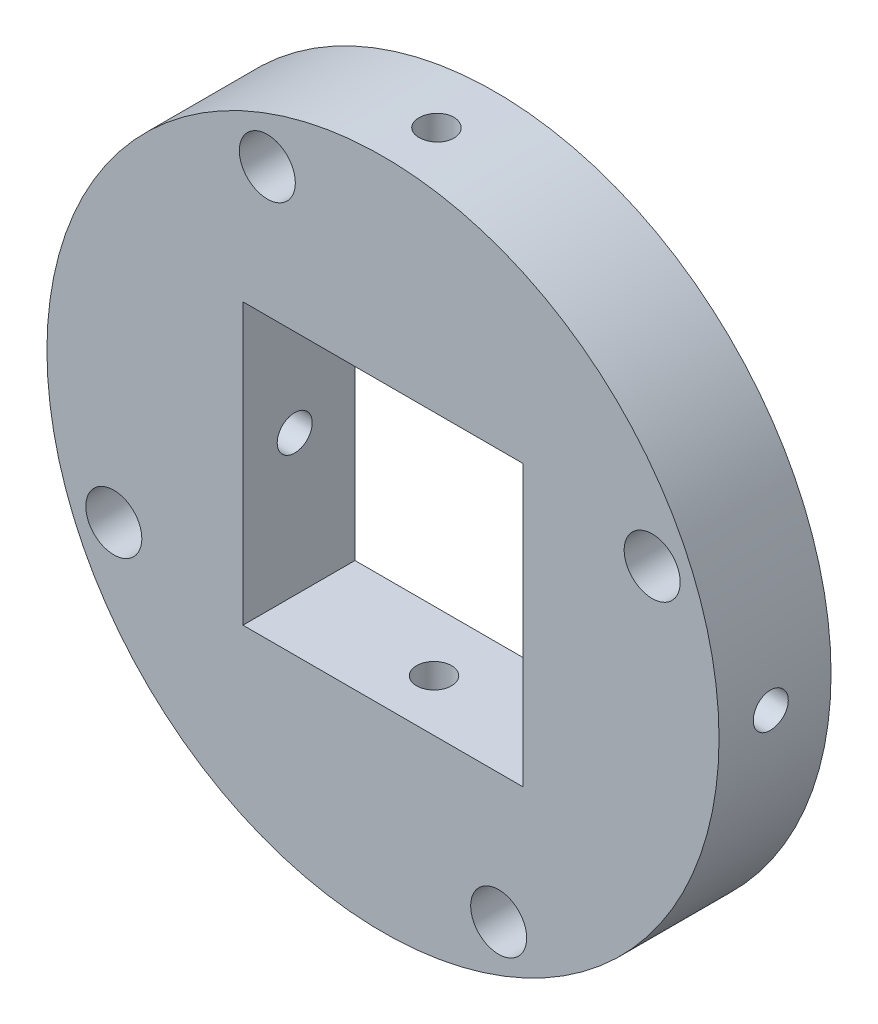
ISO-10303-21;
HEADER;
FILE_DESCRIPTION(('STEP AP214'),'2;1');
FILE_NAME('part.step','',(''),(''),'','','');
FILE_SCHEMA(('AUTOMOTIVE_DESIGN { 1 0 10303 214 1 1 1 1 }'));
ENDSEC;
DATA;
#1=APPLICATION_CONTEXT('core data for automotive mechanical design processes');
#2=APPLICATION_PROTOCOL_DEFINITION('international standard','automotive_design',2000,#1);
#3=PRODUCT_CONTEXT('',#1,'mechanical');
#4=PRODUCT('Part','Part','',(#3));
#5=PRODUCT_RELATED_PRODUCT_CATEGORY('part','',(#4));
#6=PRODUCT_DEFINITION_FORMATION('','',#4);
#7=PRODUCT_DEFINITION_CONTEXT('part definition',#1,'design');
#8=PRODUCT_DEFINITION('design','',#6,#7);
#9=PRODUCT_DEFINITION_SHAPE('','',#8);
#10=(LENGTH_UNIT() NAMED_UNIT(*) SI_UNIT(.MILLI.,.METRE.));
#11=(NAMED_UNIT(*) PLANE_ANGLE_UNIT() SI_UNIT($,.RADIAN.));
#12=(NAMED_UNIT(*) SI_UNIT($,.STERADIAN.) SOLID_ANGLE_UNIT());
#13=UNCERTAINTY_MEASURE_WITH_UNIT(LENGTH_MEASURE(1.E-05),#10,'distance_accuracy_value','');
#14=(GEOMETRIC_REPRESENTATION_CONTEXT(3) GLOBAL_UNCERTAINTY_ASSIGNED_CONTEXT((#13)) GLOBAL_UNIT_ASSIGNED_CONTEXT((#10,
#11,#12)) REPRESENTATION_CONTEXT('',''));
#15=CARTESIAN_POINT('',(0.,0.,0.));
#16=DIRECTION('',(0.,0.,1.));
#17=DIRECTION('',(1.,0.,0.));
#18=AXIS2_PLACEMENT_3D('',#15,#16,#17);
#19=CARTESIAN_POINT('',(0.,0.,2.54));
#20=DIRECTION('',(0.,0.,-1.));
#21=DIRECTION('',(-1.,0.,0.));
#22=AXIS2_PLACEMENT_3D('',#19,#20,#21);
#23=CYLINDRICAL_SURFACE('',#22,7.62);
#24=CARTESIAN_POINT('',(7.61157528645411,0.358220125957554,1.36675570991861));
#25=CARTESIAN_POINT('',(7.61157542030616,0.358219142552369,1.34447929381104));
#26=CARTESIAN_POINT('',(7.61166459620555,0.356337800310015,1.32218711008212));
#27=CARTESIAN_POINT('',(7.61201093684286,0.348859525222098,1.27821779440879));
#28=CARTESIAN_POINT('',(7.61226829914491,0.343258222511361,1.25654141712227));
#29=CARTESIAN_POINT('',(7.61291936793678,0.32850103678676,1.21444701123592));
#30=CARTESIAN_POINT('',(7.61331300453797,0.319346975523636,1.19402834392677));
#31=CARTESIAN_POINT('',(7.61418826336301,0.29774713107989,1.15502257087585));
#32=CARTESIAN_POINT('',(7.61466986490406,0.285302121377943,1.13643503616616));
#33=CARTESIAN_POINT('',(7.61566205877532,0.25745886987503,1.10159345955297));
#34=CARTESIAN_POINT('',(7.61617267827821,0.242057826839527,1.08534165681876));
#35=CARTESIAN_POINT('',(7.61715841814882,0.208745574939574,1.05565197689849));
#36=CARTESIAN_POINT('',(7.61763353706224,0.190834263327665,1.04221421494975));
#37=CARTESIAN_POINT('',(7.6184873333801,0.152998284257011,1.01852778711426));
#38=CARTESIAN_POINT('',(7.61886595751675,0.13307251320029,1.00828088197976));
#39=CARTESIAN_POINT('',(7.61947518591426,0.0917812092999957,0.991278335884875));
#40=CARTESIAN_POINT('',(7.61970579136546,0.0704156880360419,0.984522666848981));
#41=CARTESIAN_POINT('',(7.61998367575454,0.026872269166813,0.974700322198584));
#42=CARTESIAN_POINT('',(7.62003112247188,0.0046951338386622,0.971630272212549));
#43=CARTESIAN_POINT('',(7.61992830939638,-0.0398592492545566,0.969255898366968));
#44=CARTESIAN_POINT('',(7.61977805126121,-0.062236495340228,0.969951542934006));
#45=CARTESIAN_POINT('',(7.61928743313506,-0.10653305893799,0.975086013874517));
#46=CARTESIAN_POINT('',(7.6189472576899,-0.128452799598335,0.979521208596104));
#47=CARTESIAN_POINT('',(7.61810583674791,-0.17123536724386,0.992003250414249));
#48=CARTESIAN_POINT('',(7.61760459053357,-0.192098189520409,1.00005011359942));
#49=CARTESIAN_POINT('',(7.61648817714638,-0.23218655717544,1.0195312078852));
#50=CARTESIAN_POINT('',(7.61587295442553,-0.251411297513999,1.03096709230775));
#51=CARTESIAN_POINT('',(7.61458968491979,-0.287669208309988,1.05690039955903));
#52=CARTESIAN_POINT('',(7.61392163772838,-0.304702361899099,1.07139784594988));
#53=CARTESIAN_POINT('',(7.61259973413104,-0.336115017762025,1.1030632754613));
#54=CARTESIAN_POINT('',(7.61194589551978,-0.350491344627139,1.12023440957509));
#55=CARTESIAN_POINT('',(7.61072077849185,-0.37615804292512,1.15674872408798));
#56=CARTESIAN_POINT('',(7.61014950009857,-0.387448413484382,1.17609190510195));
#57=CARTESIAN_POINT('',(7.60914914121606,-0.406622657964899,1.21640316348413));
#58=CARTESIAN_POINT('',(7.60872006580085,-0.414506410335828,1.23737129880026));
#59=CARTESIAN_POINT('',(7.60804929955949,-0.426641663524858,1.28033638277681));
#60=CARTESIAN_POINT('',(7.60780760720411,-0.430893193985566,1.30233332303958));
#61=CARTESIAN_POINT('',(7.60753731564661,-0.435639481911771,1.34670393714962));
#62=CARTESIAN_POINT('',(7.60750846645876,-0.436138646569137,1.3690771380965));
#63=CARTESIAN_POINT('',(7.60766624789617,-0.433377547905694,1.41358950060319));
#64=CARTESIAN_POINT('',(7.60785287774714,-0.430117298093512,1.43572866300368));
#65=CARTESIAN_POINT('',(7.60842175307497,-0.419933500219381,1.47913210311613));
#66=CARTESIAN_POINT('',(7.60880389072747,-0.413011971315295,1.50039685609635));
#67=CARTESIAN_POINT('',(7.60972358399712,-0.395703987280415,1.5414624940549));
#68=CARTESIAN_POINT('',(7.61026114059114,-0.385317510371039,1.56126336983123));
#69=CARTESIAN_POINT('',(7.61143614601319,-0.361362952805478,1.59885945580252));
#70=CARTESIAN_POINT('',(7.61207368758202,-0.347791912457528,1.61665277728335));
#71=CARTESIAN_POINT('',(7.61338232563864,-0.317857537231442,1.64970966465684));
#72=CARTESIAN_POINT('',(7.61405342235813,-0.301494183069954,1.66497321307778));
#73=CARTESIAN_POINT('',(7.61536130462075,-0.266420487309481,1.69255210383293));
#74=CARTESIAN_POINT('',(7.61599805655897,-0.247707904580448,1.70486459783285));
#75=CARTESIAN_POINT('',(7.61717280199994,-0.208478015988567,1.72617239837601));
#76=CARTESIAN_POINT('',(7.6177107959598,-0.187960718479821,1.73516772027359));
#77=CARTESIAN_POINT('',(7.61863591342394,-0.145714201079568,1.74958085580562));
#78=CARTESIAN_POINT('',(7.61902311360735,-0.123985603581043,1.75500048866578));
#79=CARTESIAN_POINT('',(7.61961267454548,-0.0799244649569343,1.76211435967481));
#80=CARTESIAN_POINT('',(7.61981503646031,-0.0575919276228043,1.76380862120557));
#81=CARTESIAN_POINT('',(7.62002154036707,-0.0129850674783578,1.76342343357707));
#82=CARTESIAN_POINT('',(7.62002591679657,0.00928929295173115,1.76134845066643));
#83=CARTESIAN_POINT('',(7.61984607576922,0.0531738980533068,1.75349291212355));
#84=CARTESIAN_POINT('',(7.61966185796025,0.0747841414847412,1.74771234957261));
#85=CARTESIAN_POINT('',(7.61913478616896,0.11672783955228,1.73261067157288));
#86=CARTESIAN_POINT('',(7.61879193130882,0.137061287122553,1.72328953653244));
#87=CARTESIAN_POINT('',(7.617994821299,0.175875536830316,1.70137204926802));
#88=CARTESIAN_POINT('',(7.61754056948852,0.194356394477275,1.68877579521765));
#89=CARTESIAN_POINT('',(7.61657905330204,0.228963012230234,1.6606495318034));
#90=CARTESIAN_POINT('',(7.61607173249394,0.24508622069728,1.64511638496641));
#91=CARTESIAN_POINT('',(7.61506837292729,0.274501201586212,1.61155978361168));
#92=CARTESIAN_POINT('',(7.61457233697294,0.287792276962793,1.59353571782369));
#93=CARTESIAN_POINT('',(7.61365282238353,0.311172243691094,1.55549377148514));
#94=CARTESIAN_POINT('',(7.61322941694243,0.321257913395015,1.53547391140117));
#95=CARTESIAN_POINT('',(7.61250849314527,0.337912091871399,1.49403783389376));
#96=CARTESIAN_POINT('',(7.61221082637031,0.344484749764569,1.47262329738462));
#97=CARTESIAN_POINT('',(7.61185656076174,0.352204529386872,1.43702263020955));
#98=CARTESIAN_POINT('',(7.61175158497302,0.354457490582416,1.42306702412621));
#99=CARTESIAN_POINT('',(7.61161090542186,0.357465599896769,1.39499496106215));
#100=CARTESIAN_POINT('',(7.61157520159463,0.358220749416421,1.38087850423188));
#101=CARTESIAN_POINT('',(7.61157528645411,0.358220125957554,1.36675570991861));
#102=B_SPLINE_CURVE_WITH_KNOTS('',3,(#24,#25,#26,#27,#28,#29,#30,#31,#32,#33,#34,#35,#36,#37,
#38,#39,#40,#41,#42,#43,#44,#45,#46,#47,#48,#49,#50,#51,#52,#53,#54,#55,#56,#57,#58,#59,#60,#61,
#62,#63,#64,#65,#66,#67,#68,#69,#70,#71,#72,#73,#74,#75,#76,#77,#78,#79,#80,#81,#82,#83,#84,#85,
#86,#87,#88,#89,#90,#91,#92,#93,#94,#95,#96,#97,#98,#99,#100,#101),.UNSPECIFIED.,.T.,.F.,(4,2,2,
2,2,2,2,2,2,2,2,2,2,2,2,2,2,2,2,2,2,2,2,2,2,2,2,2,2,2,2,2,2,2,2,2,2,2,4),(0.,0.0667776941799472,
0.133633971694427,0.200456012461371,0.26726236183796,0.3341323344969,0.401005045001359,
0.467914591528021,0.534823599978968,0.601671303000172,0.668518445538572,0.735300744367093,
0.802083340688438,0.868898570444978,0.935714314437711,1.00260940654979,1.06950451759922,
1.13640201531212,1.20329896706851,1.27011733537909,1.33693546359333,1.40371678065477,
1.47049851747134,1.53734256791604,1.60418707999568,1.67109585237108,1.73800431503915,
1.80487870996496,1.87175268515979,1.93854747180601,2.00534238316518,2.07213766413707,
2.1389309431119,2.20579598448017,2.2726774637294,2.33962595231967,2.40649519419855,
2.44883093245627,2.49116663111907),.UNSPECIFIED.);
#103=CARTESIAN_POINT('',(7.61157528645411,0.358220125957554,1.36675570991861));
#104=VERTEX_POINT('',#103);
#105=EDGE_CURVE('E11',#104,#104,#102,.T.);
#106=ORIENTED_EDGE('',*,*,#105,.T.);
#107=EDGE_LOOP('',(#106));
#108=FACE_BOUND('',#107,.T.);
#109=CARTESIAN_POINT('',(0.358220125957474,-7.61157528645411,1.36675570991861));
#110=CARTESIAN_POINT('',(0.358219142552289,-7.61157542030617,1.34447929381104));
#111=CARTESIAN_POINT('',(0.356337800309936,-7.61166459620555,1.32218711008212));
#112=CARTESIAN_POINT('',(0.348859525222019,-7.61201093684287,1.27821779440879));
#113=CARTESIAN_POINT('',(0.343258222511281,-7.61226829914492,1.25654141712227));
#114=CARTESIAN_POINT('',(0.32850103678668,-7.61291936793678,1.21444701123592));
#115=CARTESIAN_POINT('',(0.319346975523556,-7.61331300453797,1.19402834392677));
#116=CARTESIAN_POINT('',(0.29774713107981,-7.61418826336301,1.15502257087585));
#117=CARTESIAN_POINT('',(0.285302121377863,-7.61466986490406,1.13643503616616));
#118=CARTESIAN_POINT('',(0.25745886987495,-7.61566205877532,1.10159345955297));
#119=CARTESIAN_POINT('',(0.242057826839447,-7.61617267827822,1.08534165681876));
#120=CARTESIAN_POINT('',(0.208745574939495,-7.61715841814882,1.05565197689849));
#121=CARTESIAN_POINT('',(0.190834263327585,-7.61763353706225,1.04221421494975));
#122=CARTESIAN_POINT('',(0.152998284256931,-7.61848733338011,1.01852778711426));
#123=CARTESIAN_POINT('',(0.13307251320021,-7.61886595751675,1.00828088197976));
#124=CARTESIAN_POINT('',(0.0917812092999159,-7.61947518591426,0.991278335884875));
#125=CARTESIAN_POINT('',(0.070415688035962,-7.61970579136546,0.984522666848981));
#126=CARTESIAN_POINT('',(0.0268722691667332,-7.61998367575454,0.974700322198584));
#127=CARTESIAN_POINT('',(0.00469513383858233,-7.62003112247188,0.971630272212549));
#128=CARTESIAN_POINT('',(-0.0398592492546365,-7.61992830939638,0.969255898366968));
#129=CARTESIAN_POINT('',(-0.0622364953403079,-7.61977805126121,0.969951542934006));
#130=CARTESIAN_POINT('',(-0.10653305893807,-7.61928743313506,0.975086013874517));
#131=CARTESIAN_POINT('',(-0.128452799598415,-7.6189472576899,0.979521208596104));
#132=CARTESIAN_POINT('',(-0.17123536724394,-7.61810583674791,0.992003250414249));
#133=CARTESIAN_POINT('',(-0.192098189520489,-7.61760459053357,1.00005011359942));
#134=CARTESIAN_POINT('',(-0.23218655717552,-7.61648817714638,1.0195312078852));
#135=CARTESIAN_POINT('',(-0.251411297514079,-7.61587295442553,1.03096709230775));
#136=CARTESIAN_POINT('',(-0.287669208310068,-7.61458968491979,1.05690039955903));
#137=CARTESIAN_POINT('',(-0.304702361899179,-7.61392163772837,1.07139784594988));
#138=CARTESIAN_POINT('',(-0.336115017762105,-7.61259973413104,1.1030632754613));
#139=CARTESIAN_POINT('',(-0.350491344627219,-7.61194589551977,1.12023440957509));
#140=CARTESIAN_POINT('',(-0.3761580429252,-7.61072077849185,1.15674872408798));
#141=CARTESIAN_POINT('',(-0.387448413484462,-7.61014950009856,1.17609190510195));
#142=CARTESIAN_POINT('',(-0.406622657964978,-7.60914914121605,1.21640316348413));
#143=CARTESIAN_POINT('',(-0.414506410335908,-7.60872006580085,1.23737129880026));
#144=CARTESIAN_POINT('',(-0.426641663524937,-7.60804929955949,1.28033638277681));
#145=CARTESIAN_POINT('',(-0.430893193985645,-7.6078076072041,1.30233332303958));
#146=CARTESIAN_POINT('',(-0.43563948191185,-7.6075373156466,1.34670393714962));
#147=CARTESIAN_POINT('',(-0.436138646569217,-7.60750846645876,1.3690771380965));
#148=CARTESIAN_POINT('',(-0.433377547905774,-7.60766624789617,1.4135895006032));
#149=CARTESIAN_POINT('',(-0.430117298093592,-7.60785287774714,1.43572866300368));
#150=CARTESIAN_POINT('',(-0.419933500219461,-7.60842175307496,1.47913210311613));
#151=CARTESIAN_POINT('',(-0.413011971315375,-7.60880389072746,1.50039685609635));
#152=CARTESIAN_POINT('',(-0.395703987280494,-7.60972358399711,1.5414624940549));
#153=CARTESIAN_POINT('',(-0.385317510371118,-7.61026114059113,1.56126336983123));
#154=CARTESIAN_POINT('',(-0.361362952805558,-7.61143614601319,1.59885945580252));
#155=CARTESIAN_POINT('',(-0.347791912457607,-7.61207368758202,1.61665277728335));
#156=CARTESIAN_POINT('',(-0.317857537231522,-7.61338232563864,1.64970966465684));
#157=CARTESIAN_POINT('',(-0.301494183070033,-7.61405342235813,1.66497321307778));
#158=CARTESIAN_POINT('',(-0.26642048730956,-7.61536130462075,1.69255210383293));
#159=CARTESIAN_POINT('',(-0.247707904580528,-7.61599805655897,1.70486459783285));
#160=CARTESIAN_POINT('',(-0.208478015988646,-7.61717280199993,1.72617239837601));
#161=CARTESIAN_POINT('',(-0.187960718479901,-7.6177107959598,1.73516772027359));
#162=CARTESIAN_POINT('',(-0.145714201079648,-7.61863591342393,1.74958085580562));
#163=CARTESIAN_POINT('',(-0.123985603581122,-7.61902311360734,1.75500048866578));
#164=CARTESIAN_POINT('',(-0.0799244649570139,-7.61961267454547,1.76211435967481));
#165=CARTESIAN_POINT('',(-0.0575919276228839,-7.61981503646031,1.76380862120557));
#166=CARTESIAN_POINT('',(-0.0129850674784374,-7.62002154036707,1.76342343357707));
#167=CARTESIAN_POINT('',(0.00928929295165153,-7.62002591679657,1.76134845066643));
#168=CARTESIAN_POINT('',(0.0531738980532271,-7.61984607576922,1.75349291212355));
#169=CARTESIAN_POINT('',(0.0747841414846616,-7.61966185796025,1.74771234957261));
#170=CARTESIAN_POINT('',(0.1167278395522,-7.61913478616896,1.73261067157288));
#171=CARTESIAN_POINT('',(0.137061287122473,-7.61879193130882,1.72328953653244));
#172=CARTESIAN_POINT('',(0.175875536830236,-7.617994821299,1.70137204926802));
#173=CARTESIAN_POINT('',(0.194356394477196,-7.61754056948852,1.68877579521765));
#174=CARTESIAN_POINT('',(0.228963012230154,-7.61657905330205,1.6606495318034));
#175=CARTESIAN_POINT('',(0.2450862206972,-7.61607173249395,1.64511638496641));
#176=CARTESIAN_POINT('',(0.274501201586132,-7.6150683729273,1.61155978361168));
#177=CARTESIAN_POINT('',(0.287792276962714,-7.61457233697295,1.59353571782369));
#178=CARTESIAN_POINT('',(0.311172243691014,-7.61365282238353,1.55549377148514));
#179=CARTESIAN_POINT('',(0.321257913394936,-7.61322941694244,1.53547391140117));
#180=CARTESIAN_POINT('',(0.33791209187132,-7.61250849314527,1.49403783389376));
#181=CARTESIAN_POINT('',(0.34448474976449,-7.61221082637032,1.47262329738462));
#182=CARTESIAN_POINT('',(0.352204529386793,-7.61185656076175,1.43702263020955));
#183=CARTESIAN_POINT('',(0.354457490582336,-7.61175158497303,1.42306702412621));
#184=CARTESIAN_POINT('',(0.357465599896689,-7.61161090542187,1.39499496106215));
#185=CARTESIAN_POINT('',(0.358220749416341,-7.61157520159463,1.38087850423188));
#186=CARTESIAN_POINT('',(0.358220125957474,-7.61157528645411,1.36675570991861));
#187=B_SPLINE_CURVE_WITH_KNOTS('',3,(#109,#110,#111,#112,#113,#114,#115,#116,#117,#118,#119,
#120,#121,#122,#123,#124,#125,#126,#127,#128,#129,#130,#131,#132,#133,#134,#135,#136,#137,#138,
#139,#140,#141,#142,#143,#144,#145,#146,#147,#148,#149,#150,#151,#152,#153,#154,#155,#156,#157,
#158,#159,#160,#161,#162,#163,#164,#165,#166,#167,#168,#169,#170,#171,#172,#173,#174,#175,#176,
#177,#178,#179,#180,#181,#182,#183,#184,#185,#186),.UNSPECIFIED.,.T.,.F.,(4,2,2,2,2,2,2,2,2,2,2,
2,2,2,2,2,2,2,2,2,2,2,2,2,2,2,2,2,2,2,2,2,2,2,2,2,2,2,4),(0.,0.0667776941799472,
0.133633971694427,0.200456012461371,0.26726236183796,0.334132334496899,0.401005045001359,
0.467914591528021,0.534823599978968,0.601671303000172,0.668518445538572,0.735300744367093,
0.802083340688438,0.868898570444978,0.935714314437711,1.00260940654979,1.06950451759922,
1.13640201531212,1.20329896706851,1.27011733537909,1.33693546359333,1.40371678065477,
1.47049851747134,1.53734256791604,1.60418707999568,1.67109585237108,1.73800431503915,
1.80487870996496,1.87175268515979,1.93854747180601,2.00534238316518,2.07213766413707,
2.1389309431119,2.20579598448017,2.2726774637294,2.33962595231967,2.40649519419855,
2.44883093245627,2.49116663111907),.UNSPECIFIED.);
#188=CARTESIAN_POINT('',(0.358220125957474,-7.61157528645411,1.36675570991861));
#189=VERTEX_POINT('',#188);
#190=EDGE_CURVE('E52',#189,#189,#187,.T.);
#191=ORIENTED_EDGE('',*,*,#190,.T.);
#192=EDGE_LOOP('',(#191));
#193=FACE_BOUND('',#192,.T.);
#194=CARTESIAN_POINT('',(-7.62,0.,1.76173912582453));
#195=CARTESIAN_POINT('',(-7.61999986885556,-0.0221771171797002,1.75956515058576));
#196=CARTESIAN_POINT('',(-7.61990216762267,-0.0441865362157089,1.75551763094838));
#197=CARTESIAN_POINT('',(-7.61953120538924,-0.0872306366793438,1.74378387427316));
#198=CARTESIAN_POINT('',(-7.61925773691107,-0.108264134617025,1.73609333980481));
#199=CARTESIAN_POINT('',(-7.61857521819156,-0.148731648118251,1.71729657411984));
#200=CARTESIAN_POINT('',(-7.61816623819072,-0.168166485823977,1.70619211267907));
#201=CARTESIAN_POINT('',(-7.61726705320249,-0.204891717728675,1.68088459451996));
#202=CARTESIAN_POINT('',(-7.61677686747193,-0.222182618637718,1.66668227216533));
#203=CARTESIAN_POINT('',(-7.61577723832605,-0.25415278340689,1.63556440558782));
#204=CARTESIAN_POINT('',(-7.61526777705822,-0.268829550591721,1.61864629660646));
#205=CARTESIAN_POINT('',(-7.61429372362647,-0.295135428479725,1.58258459224292));
#206=CARTESIAN_POINT('',(-7.61382913317539,-0.306764422870122,1.56344091196605));
#207=CARTESIAN_POINT('',(-7.61300223138791,-0.326644288192965,1.52346863748255));
#208=CARTESIAN_POINT('',(-7.61263993047208,-0.334894814988066,1.50263987188847));
#209=CARTESIAN_POINT('',(-7.61206219929337,-0.347780115376084,1.45989056677169));
#210=CARTESIAN_POINT('',(-7.6118467676127,-0.352414923873261,1.43797003779047));
#211=CARTESIAN_POINT('',(-7.61158931569695,-0.357932749497339,1.39368638389527));
#212=CARTESIAN_POINT('',(-7.61154709645963,-0.358820072111927,1.37132379656871));
#213=CARTESIAN_POINT('',(-7.61164067714948,-0.35682929054109,1.32676735548565));
#214=CARTESIAN_POINT('',(-7.61177647601285,-0.353951208856852,1.30457350072165));
#215=CARTESIAN_POINT('',(-7.61220936125609,-0.344515130321847,1.26099869446018));
#216=CARTESIAN_POINT('',(-7.61250634691508,-0.337959431419889,1.23961724423323));
#217=CARTESIAN_POINT('',(-7.61322523009817,-0.321356839714289,1.19825796043611));
#218=CARTESIAN_POINT('',(-7.61364712850749,-0.311309922169594,1.17828013681416));
#219=CARTESIAN_POINT('',(-7.61456443849099,-0.288000072655221,1.14027591654059));
#220=CARTESIAN_POINT('',(-7.61505991421134,-0.274734327985338,1.12225124664534));
#221=CARTESIAN_POINT('',(-7.6160626379345,-0.245367394676621,1.0886827233787));
#222=CARTESIAN_POINT('',(-7.61656988601318,-0.229266187760723,1.07313888599969));
#223=CARTESIAN_POINT('',(-7.61753269402297,-0.194666094619713,1.0449572754602));
#224=CARTESIAN_POINT('',(-7.61798820122753,-0.17616480298021,1.0323224535083));
#225=CARTESIAN_POINT('',(-7.6187876684135,-0.137301460768509,1.01033802931563));
#226=CARTESIAN_POINT('',(-7.61913162872158,-0.11693941564573,1.00098841745416));
#227=CARTESIAN_POINT('',(-7.61966037446177,-0.0749414956786229,0.98584433621867));
#228=CARTESIAN_POINT('',(-7.61984522851488,-0.0533061742918698,0.980048334517328));
#229=CARTESIAN_POINT('',(-7.62002589451295,-0.00936880899855148,0.972171083765213));
#230=CARTESIAN_POINT('',(-7.62002170801394,0.0129332294186191,0.970089804137948));
#231=CARTESIAN_POINT('',(-7.61981533796835,0.0575423877467263,0.969701859289245));
#232=CARTESIAN_POINT('',(-7.61961339146518,0.0798494696102331,0.971390678171151));
#233=CARTESIAN_POINT('',(-7.61902505364792,0.123861941803688,0.978485264798734));
#234=CARTESIAN_POINT('',(-7.61863866242653,0.14556733243604,0.983891030676275));
#235=CARTESIAN_POINT('',(-7.61771567703452,0.187758997634798,0.99826439028438));
#236=CARTESIAN_POINT('',(-7.61717909730894,0.208245389214126,1.0072316415082));
#237=CARTESIAN_POINT('',(-7.61600727172507,0.24742230379271,1.02847297454776));
#238=CARTESIAN_POINT('',(-7.61537202510152,0.266112812861051,1.04074708201245));
#239=CARTESIAN_POINT('',(-7.61406547568923,0.301190819467493,1.0682704838702));
#240=CARTESIAN_POINT('',(-7.61339413212977,0.317575633904413,1.08352319595586));
#241=CARTESIAN_POINT('',(-7.61208462217063,0.347553453379049,1.11656312336826));
#242=CARTESIAN_POINT('',(-7.61144645592033,0.361146445848756,1.13435035010408));
#243=CARTESIAN_POINT('',(-7.61026903156839,0.385162885908279,1.17196777470075));
#244=CARTESIAN_POINT('',(-7.60972983385748,0.395584400793447,1.19179920849121));
#245=CARTESIAN_POINT('',(-7.60880729252677,0.412949911100381,1.23293365342153));
#246=CARTESIAN_POINT('',(-7.60842394777759,0.419893931721781,1.25423665389641));
#247=CARTESIAN_POINT('',(-7.60785377766296,0.430101469325973,1.29768946125359));
#248=CARTESIAN_POINT('',(-7.60766677782135,0.4333682541632,1.31983849815722));
#249=CARTESIAN_POINT('',(-7.60750845586108,0.436138852861182,1.3643714197689));
#250=CARTESIAN_POINT('',(-7.60753713267066,0.435642685421,1.38675530330938));
#251=CARTESIAN_POINT('',(-7.60780698972548,0.430904045774061,1.43109881660834));
#252=CARTESIAN_POINT('',(-7.60804795717713,0.426665324977991,1.45305884870351));
#253=CARTESIAN_POINT('',(-7.60871670795648,0.414567773853601,1.49595505061198));
#254=CARTESIAN_POINT('',(-7.60914449222386,0.406708925316399,1.51689121527475));
#255=CARTESIAN_POINT('',(-7.61014224721294,0.387590226379823,1.55715663317619));
#256=CARTESIAN_POINT('',(-7.6107122845974,0.37632878093032,1.57648512734918));
#257=CARTESIAN_POINT('',(-7.61193503838241,0.350725880654363,1.61297747739016));
#258=CARTESIAN_POINT('',(-7.61258775231338,0.336384517817614,1.63014139788444));
#259=CARTESIAN_POINT('',(-7.61390933105865,0.305009720628477,1.66183818029499));
#260=CARTESIAN_POINT('',(-7.6145782127768,0.287973355428264,1.6763681403963));
#261=CARTESIAN_POINT('',(-7.61586355558693,0.251696488275211,1.70236527865856));
#262=CARTESIAN_POINT('',(-7.6164800039145,0.232455452276972,1.71383171247981));
#263=CARTESIAN_POINT('',(-7.61759938773509,0.192309293031597,1.73337634090647));
#264=CARTESIAN_POINT('',(-7.61810226128808,0.171403270119814,1.74145268871919));
#265=CARTESIAN_POINT('',(-7.6189457140944,0.128545058433268,1.75396974136817));
#266=CARTESIAN_POINT('',(-7.61928648502526,0.10659413916341,1.75841474455788));
#267=CARTESIAN_POINT('',(-7.61968746808734,0.0704304868721951,1.76261236164584));
#268=CARTESIAN_POINT('',(-7.61980476471049,0.0563392431850566,1.76348921581007));
#269=CARTESIAN_POINT('',(-7.61996107212195,0.0281429354968719,1.76374064813419));
#270=CARTESIAN_POINT('',(-7.62000008301299,0.014037871513983,1.76311522826512));
#271=CARTESIAN_POINT('',(-7.62,0.,1.76173912582453));
#272=B_SPLINE_CURVE_WITH_KNOTS('',3,(#194,#195,#196,#197,#198,#199,#200,#201,#202,#203,#204,
#205,#206,#207,#208,#209,#210,#211,#212,#213,#214,#215,#216,#217,#218,#219,#220,#221,#222,#223,
#224,#225,#226,#227,#228,#229,#230,#231,#232,#233,#234,#235,#236,#237,#238,#239,#240,#241,#242,
#243,#244,#245,#246,#247,#248,#249,#250,#251,#252,#253,#254,#255,#256,#257,#258,#259,#260,#261,
#262,#263,#264,#265,#266,#267,#268,#269,#270,#271),.UNSPECIFIED.,.T.,.F.,(4,2,2,2,2,2,2,2,2,2,2,
2,2,2,2,2,2,2,2,2,2,2,2,2,2,2,2,2,2,2,2,2,2,2,2,2,2,2,4),(0.,0.0667987444066227,
0.133676483976322,0.200519612494994,0.267346912697238,0.334237699215344,0.401131038128632,
0.468031189234831,0.534930694513856,0.601753317986349,0.668575542144088,0.735356059055276,
0.802137049226445,0.868976605969608,0.935816593568652,1.00272409473048,1.06963139995273,
1.13650983421712,1.20338771799152,1.27018553713603,1.33698332270804,1.40377468591624,
1.47056656719265,1.53743554154289,1.60430481691213,1.67121476132053,1.73812422085953,
1.80497417281353,1.87182379257337,1.93860648047814,2.00538950429683,2.07220388298298,
2.13901626636224,2.2059018149555,2.27280359986684,2.33974178322931,2.40660061786714,
2.44888354463319,2.49116641592243),.UNSPECIFIED.);
#273=CARTESIAN_POINT('',(-7.62,0.,1.76173912582453));
#274=VERTEX_POINT('',#273);
#275=EDGE_CURVE('E138',#274,#274,#272,.T.);
#276=ORIENTED_EDGE('',*,*,#275,.T.);
#277=EDGE_LOOP('',(#276));
#278=FACE_BOUND('',#277,.T.);
#279=CARTESIAN_POINT('',(-0.358220125957474,7.61157528645411,1.36675570991861));
#280=CARTESIAN_POINT('',(-0.358219142552289,7.61157542030617,1.34447929381104));
#281=CARTESIAN_POINT('',(-0.356337800309936,7.61166459620555,1.32218711008212));
#282=CARTESIAN_POINT('',(-0.348859525222019,7.61201093684287,1.27821779440879));
#283=CARTESIAN_POINT('',(-0.343258222511281,7.61226829914492,1.25654141712227));
#284=CARTESIAN_POINT('',(-0.32850103678668,7.61291936793678,1.21444701123592));
#285=CARTESIAN_POINT('',(-0.319346975523556,7.61331300453797,1.19402834392677));
#286=CARTESIAN_POINT('',(-0.29774713107981,7.61418826336301,1.15502257087585));
#287=CARTESIAN_POINT('',(-0.285302121377863,7.61466986490406,1.13643503616616));
#288=CARTESIAN_POINT('',(-0.25745886987495,7.61566205877532,1.10159345955297));
#289=CARTESIAN_POINT('',(-0.242057826839447,7.61617267827822,1.08534165681876));
#290=CARTESIAN_POINT('',(-0.208745574939495,7.61715841814882,1.05565197689849));
#291=CARTESIAN_POINT('',(-0.190834263327585,7.61763353706225,1.04221421494975));
#292=CARTESIAN_POINT('',(-0.152998284256931,7.61848733338011,1.01852778711426));
#293=CARTESIAN_POINT('',(-0.13307251320021,7.61886595751675,1.00828088197976));
#294=CARTESIAN_POINT('',(-0.0917812092999159,7.61947518591426,0.991278335884875));
#295=CARTESIAN_POINT('',(-0.070415688035962,7.61970579136546,0.984522666848981));
#296=CARTESIAN_POINT('',(-0.0268722691667332,7.61998367575454,0.974700322198584));
#297=CARTESIAN_POINT('',(-0.00469513383858233,7.62003112247188,0.971630272212549));
#298=CARTESIAN_POINT('',(0.0398592492546365,7.61992830939638,0.969255898366968));
#299=CARTESIAN_POINT('',(0.0622364953403079,7.61977805126121,0.969951542934006));
#300=CARTESIAN_POINT('',(0.10653305893807,7.61928743313506,0.975086013874517));
#301=CARTESIAN_POINT('',(0.128452799598415,7.6189472576899,0.979521208596104));
#302=CARTESIAN_POINT('',(0.17123536724394,7.61810583674791,0.992003250414249));
#303=CARTESIAN_POINT('',(0.192098189520489,7.61760459053357,1.00005011359942));
#304=CARTESIAN_POINT('',(0.23218655717552,7.61648817714638,1.0195312078852));
#305=CARTESIAN_POINT('',(0.251411297514079,7.61587295442553,1.03096709230775));
#306=CARTESIAN_POINT('',(0.287669208310068,7.61458968491979,1.05690039955903));
#307=CARTESIAN_POINT('',(0.304702361899179,7.61392163772837,1.07139784594988));
#308=CARTESIAN_POINT('',(0.336115017762105,7.61259973413104,1.1030632754613));
#309=CARTESIAN_POINT('',(0.350491344627219,7.61194589551977,1.12023440957509));
#310=CARTESIAN_POINT('',(0.3761580429252,7.61072077849185,1.15674872408798));
#311=CARTESIAN_POINT('',(0.387448413484462,7.61014950009856,1.17609190510195));
#312=CARTESIAN_POINT('',(0.406622657964978,7.60914914121605,1.21640316348413));
#313=CARTESIAN_POINT('',(0.414506410335908,7.60872006580085,1.23737129880026));
#314=CARTESIAN_POINT('',(0.426641663524937,7.60804929955949,1.28033638277681));
#315=CARTESIAN_POINT('',(0.430893193985645,7.6078076072041,1.30233332303958));
#316=CARTESIAN_POINT('',(0.43563948191185,7.6075373156466,1.34670393714962));
#317=CARTESIAN_POINT('',(0.436138646569217,7.60750846645876,1.3690771380965));
#318=CARTESIAN_POINT('',(0.433377547905774,7.60766624789617,1.4135895006032));
#319=CARTESIAN_POINT('',(0.430117298093592,7.60785287774714,1.43572866300368));
#320=CARTESIAN_POINT('',(0.419933500219461,7.60842175307496,1.47913210311613));
#321=CARTESIAN_POINT('',(0.413011971315375,7.60880389072746,1.50039685609635));
#322=CARTESIAN_POINT('',(0.395703987280494,7.60972358399711,1.5414624940549));
#323=CARTESIAN_POINT('',(0.385317510371118,7.61026114059113,1.56126336983123));
#324=CARTESIAN_POINT('',(0.361362952805558,7.61143614601319,1.59885945580252));
#325=CARTESIAN_POINT('',(0.347791912457607,7.61207368758202,1.61665277728335));
#326=CARTESIAN_POINT('',(0.317857537231522,7.61338232563864,1.64970966465684));
#327=CARTESIAN_POINT('',(0.301494183070033,7.61405342235813,1.66497321307778));
#328=CARTESIAN_POINT('',(0.26642048730956,7.61536130462075,1.69255210383293));
#329=CARTESIAN_POINT('',(0.247707904580528,7.61599805655897,1.70486459783285));
#330=CARTESIAN_POINT('',(0.208478015988646,7.61717280199993,1.72617239837601));
#331=CARTESIAN_POINT('',(0.187960718479901,7.6177107959598,1.73516772027359));
#332=CARTESIAN_POINT('',(0.145714201079648,7.61863591342393,1.74958085580562));
#333=CARTESIAN_POINT('',(0.123985603581122,7.61902311360734,1.75500048866578));
#334=CARTESIAN_POINT('',(0.0799244649570139,7.61961267454547,1.76211435967481));
#335=CARTESIAN_POINT('',(0.0575919276228839,7.61981503646031,1.76380862120557));
#336=CARTESIAN_POINT('',(0.0129850674784374,7.62002154036707,1.76342343357707));
#337=CARTESIAN_POINT('',(-0.00928929295165153,7.62002591679657,1.76134845066643));
#338=CARTESIAN_POINT('',(-0.0531738980532271,7.61984607576922,1.75349291212355));
#339=CARTESIAN_POINT('',(-0.0747841414846616,7.61966185796025,1.74771234957261));
#340=CARTESIAN_POINT('',(-0.1167278395522,7.61913478616896,1.73261067157288));
#341=CARTESIAN_POINT('',(-0.137061287122473,7.61879193130882,1.72328953653244));
#342=CARTESIAN_POINT('',(-0.175875536830236,7.617994821299,1.70137204926802));
#343=CARTESIAN_POINT('',(-0.194356394477196,7.61754056948852,1.68877579521765));
#344=CARTESIAN_POINT('',(-0.228963012230154,7.61657905330205,1.6606495318034));
#345=CARTESIAN_POINT('',(-0.2450862206972,7.61607173249395,1.64511638496641));
#346=CARTESIAN_POINT('',(-0.274501201586132,7.6150683729273,1.61155978361168));
#347=CARTESIAN_POINT('',(-0.287792276962714,7.61457233697295,1.59353571782369));
#348=CARTESIAN_POINT('',(-0.311172243691014,7.61365282238353,1.55549377148514));
#349=CARTESIAN_POINT('',(-0.321257913394936,7.61322941694244,1.53547391140117));
#350=CARTESIAN_POINT('',(-0.33791209187132,7.61250849314527,1.49403783389376));
#351=CARTESIAN_POINT('',(-0.34448474976449,7.61221082637032,1.47262329738462));
#352=CARTESIAN_POINT('',(-0.352204529386793,7.61185656076175,1.43702263020955));
#353=CARTESIAN_POINT('',(-0.354457490582336,7.61175158497303,1.42306702412621));
#354=CARTESIAN_POINT('',(-0.357465599896689,7.61161090542187,1.39499496106215));
#355=CARTESIAN_POINT('',(-0.358220749416341,7.61157520159463,1.38087850423188));
#356=CARTESIAN_POINT('',(-0.358220125957474,7.61157528645411,1.36675570991861));
#357=B_SPLINE_CURVE_WITH_KNOTS('',3,(#279,#280,#281,#282,#283,#284,#285,#286,#287,#288,#289,
#290,#291,#292,#293,#294,#295,#296,#297,#298,#299,#300,#301,#302,#303,#304,#305,#306,#307,#308,
#309,#310,#311,#312,#313,#314,#315,#316,#317,#318,#319,#320,#321,#322,#323,#324,#325,#326,#327,
#328,#329,#330,#331,#332,#333,#334,#335,#336,#337,#338,#339,#340,#341,#342,#343,#344,#345,#346,
#347,#348,#349,#350,#351,#352,#353,#354,#355,#356),.UNSPECIFIED.,.T.,.F.,(4,2,2,2,2,2,2,2,2,2,2,
2,2,2,2,2,2,2,2,2,2,2,2,2,2,2,2,2,2,2,2,2,2,2,2,2,2,2,4),(0.,0.0667776941799472,
0.133633971694427,0.200456012461371,0.26726236183796,0.334132334496899,0.401005045001359,
0.467914591528021,0.534823599978968,0.601671303000172,0.668518445538572,0.735300744367093,
0.802083340688438,0.868898570444978,0.935714314437711,1.00260940654979,1.06950451759922,
1.13640201531212,1.20329896706851,1.27011733537909,1.33693546359333,1.40371678065477,
1.47049851747134,1.53734256791604,1.60418707999568,1.67109585237108,1.73800431503915,
1.80487870996496,1.87175268515979,1.93854747180601,2.00534238316518,2.07213766413707,
2.1389309431119,2.20579598448017,2.2726774637294,2.33962595231967,2.40649519419855,
2.44883093245627,2.49116663111907),.UNSPECIFIED.);
#358=CARTESIAN_POINT('',(-0.358220125957474,7.61157528645411,1.36675570991861));
#359=VERTEX_POINT('',#358);
#360=EDGE_CURVE('E129',#359,#359,#357,.T.);
#361=ORIENTED_EDGE('',*,*,#360,.T.);
#362=EDGE_LOOP('',(#361));
#363=FACE_BOUND('',#362,.T.);
#364=CARTESIAN_POINT('',(0.,0.,2.54));
#365=DIRECTION('',(0.,0.,1.));
#366=DIRECTION('',(1.,0.,0.));
#367=AXIS2_PLACEMENT_3D('',#364,#365,#366);
#368=CIRCLE('',#367,7.62);
#369=CARTESIAN_POINT('',(7.62,0.,2.54));
#370=VERTEX_POINT('',#369);
#371=EDGE_CURVE('E126',#370,#370,#368,.T.);
#372=ORIENTED_EDGE('',*,*,#371,.F.);
#373=EDGE_LOOP('',(#372));
#374=FACE_BOUND('',#373,.T.);
#375=CARTESIAN_POINT('',(0.,0.,0.));
#376=DIRECTION('',(0.,0.,1.));
#377=DIRECTION('',(1.,0.,0.));
#378=AXIS2_PLACEMENT_3D('',#375,#376,#377);
#379=CIRCLE('',#378,7.62);
#380=CARTESIAN_POINT('',(7.62,0.,0.));
#381=VERTEX_POINT('',#380);
#382=EDGE_CURVE('E122',#381,#381,#379,.T.);
#383=ORIENTED_EDGE('',*,*,#382,.T.);
#384=EDGE_LOOP('',(#383));
#385=FACE_BOUND('',#384,.T.);
#386=ADVANCED_FACE('F40',(#108,#193,#278,#363,#374,#385),#23,.T.);
#387=CARTESIAN_POINT('',(0.,0.,2.54));
#388=DIRECTION('',(0.,0.,1.));
#389=DIRECTION('',(1.,0.,0.));
#390=AXIS2_PLACEMENT_3D('',#387,#388,#389);
#391=PLANE('',#390);
#392=CARTESIAN_POINT('',(-6.10353680175279,-2.62273910871971,2.54));
#393=DIRECTION('',(0.,0.,1.));
#394=DIRECTION('',(0.,1.,0.));
#395=AXIS2_PLACEMENT_3D('',#392,#393,#394);
#396=CIRCLE('',#395,0.635);
#397=CARTESIAN_POINT('',(-6.10353680175279,-1.98773910871971,2.54));
#398=VERTEX_POINT('',#397);
#399=EDGE_CURVE('E225',#398,#398,#396,.T.);
#400=ORIENTED_EDGE('',*,*,#399,.F.);
#401=EDGE_LOOP('',(#400));
#402=FACE_BOUND('',#401,.T.);
#403=CARTESIAN_POINT('',(2.62273910871968,-6.1035368017528,2.54));
#404=DIRECTION('',(0.,0.,1.));
#405=DIRECTION('',(-1.,0.,0.));
#406=AXIS2_PLACEMENT_3D('',#403,#404,#405);
#407=CIRCLE('',#406,0.635);
#408=CARTESIAN_POINT('',(1.98773910871968,-6.1035368017528,2.54));
#409=VERTEX_POINT('',#408);
#410=EDGE_CURVE('E231',#409,#409,#407,.T.);
#411=ORIENTED_EDGE('',*,*,#410,.F.);
#412=EDGE_LOOP('',(#411));
#413=FACE_BOUND('',#412,.T.);
#414=CARTESIAN_POINT('',(6.10353680175277,2.62273910871975,2.54));
#415=DIRECTION('',(0.,0.,1.));
#416=DIRECTION('',(0.,-1.,0.));
#417=AXIS2_PLACEMENT_3D('',#414,#415,#416);
#418=CIRCLE('',#417,0.635);
#419=CARTESIAN_POINT('',(6.10353680175278,1.98773910871975,2.54));
#420=VERTEX_POINT('',#419);
#421=EDGE_CURVE('E212',#420,#420,#418,.T.);
#422=ORIENTED_EDGE('',*,*,#421,.F.);
#423=EDGE_LOOP('',(#422));
#424=FACE_BOUND('',#423,.T.);
#425=CARTESIAN_POINT('',(-2.62273910871968,6.1035368017528,2.54));
#426=DIRECTION('',(0.,0.,1.));
#427=DIRECTION('',(1.,0.,0.));
#428=AXIS2_PLACEMENT_3D('',#425,#426,#427);
#429=CIRCLE('',#428,0.635);
#430=CARTESIAN_POINT('',(-1.98773910871968,6.1035368017528,2.54));
#431=VERTEX_POINT('',#430);
#432=EDGE_CURVE('E109',#431,#431,#429,.T.);
#433=ORIENTED_EDGE('',*,*,#432,.F.);
#434=EDGE_LOOP('',(#433));
#435=FACE_BOUND('',#434,.T.);
#436=DIRECTION('',(0.,1.,0.));
#437=VECTOR('',#436,1.);
#438=CARTESIAN_POINT('',(3.175,3.175,2.54));
#439=LINE('',#438,#437);
#440=CARTESIAN_POINT('',(3.175,-3.175,2.54));
#441=VERTEX_POINT('',#440);
#442=CARTESIAN_POINT('',(3.175,3.175,2.54));
#443=VERTEX_POINT('',#442);
#444=EDGE_CURVE('E59',#441,#443,#439,.T.);
#445=ORIENTED_EDGE('',*,*,#444,.F.);
#446=DIRECTION('',(1.,0.,0.));
#447=VECTOR('',#446,1.);
#448=CARTESIAN_POINT('',(-3.175,-3.175,2.54));
#449=LINE('',#448,#447);
#450=CARTESIAN_POINT('',(-3.175,-3.175,2.54));
#451=VERTEX_POINT('',#450);
#452=EDGE_CURVE('E103',#451,#441,#449,.T.);
#453=ORIENTED_EDGE('',*,*,#452,.F.);
#454=DIRECTION('',(0.,-1.,0.));
#455=VECTOR('',#454,1.);
#456=CARTESIAN_POINT('',(-3.175,3.175,2.54));
#457=LINE('',#456,#455);
#458=CARTESIAN_POINT('',(-3.175,3.175,2.54));
#459=VERTEX_POINT('',#458);
#460=EDGE_CURVE('E106',#459,#451,#457,.T.);
#461=ORIENTED_EDGE('',*,*,#460,.F.);
#462=DIRECTION('',(-1.,0.,0.));
#463=VECTOR('',#462,1.);
#464=CARTESIAN_POINT('',(-3.175,3.175,2.54));
#465=LINE('',#464,#463);
#466=EDGE_CURVE('E115',#443,#459,#465,.T.);
#467=ORIENTED_EDGE('',*,*,#466,.F.);
#468=EDGE_LOOP('',(#445,#453,#461,#467));
#469=FACE_BOUND('',#468,.T.);
#470=ORIENTED_EDGE('',*,*,#371,.T.);
#471=EDGE_LOOP('',(#470));
#472=FACE_BOUND('',#471,.T.);
#473=ADVANCED_FACE('F181',(#402,#413,#424,#435,#469,#472),#391,.T.);
#474=CARTESIAN_POINT('',(0.,0.,0.));
#475=DIRECTION('',(0.,0.,1.));
#476=DIRECTION('',(1.,0.,0.));
#477=AXIS2_PLACEMENT_3D('',#474,#475,#476);
#478=PLANE('',#477);
#479=CARTESIAN_POINT('',(-6.10353680175279,-2.62273910871971,0.));
#480=DIRECTION('',(0.,0.,1.));
#481=DIRECTION('',(0.,1.,0.));
#482=AXIS2_PLACEMENT_3D('',#479,#480,#481);
#483=CIRCLE('',#482,0.635);
#484=CARTESIAN_POINT('',(-6.10353680175279,-1.98773910871971,0.));
#485=VERTEX_POINT('',#484);
#486=EDGE_CURVE('E223',#485,#485,#483,.T.);
#487=ORIENTED_EDGE('',*,*,#486,.T.);
#488=EDGE_LOOP('',(#487));
#489=FACE_BOUND('',#488,.T.);
#490=CARTESIAN_POINT('',(2.62273910871968,-6.1035368017528,0.));
#491=DIRECTION('',(0.,0.,1.));
#492=DIRECTION('',(-1.,0.,0.));
#493=AXIS2_PLACEMENT_3D('',#490,#491,#492);
#494=CIRCLE('',#493,0.635);
#495=CARTESIAN_POINT('',(1.98773910871968,-6.1035368017528,0.));
#496=VERTEX_POINT('',#495);
#497=EDGE_CURVE('E228',#496,#496,#494,.T.);
#498=ORIENTED_EDGE('',*,*,#497,.T.);
#499=EDGE_LOOP('',(#498));
#500=FACE_BOUND('',#499,.T.);
#501=CARTESIAN_POINT('',(6.10353680175277,2.62273910871975,0.));
#502=DIRECTION('',(0.,0.,1.));
#503=DIRECTION('',(0.,-1.,0.));
#504=AXIS2_PLACEMENT_3D('',#501,#502,#503);
#505=CIRCLE('',#504,0.635);
#506=CARTESIAN_POINT('',(6.10353680175278,1.98773910871975,0.));
#507=VERTEX_POINT('',#506);
#508=EDGE_CURVE('E216',#507,#507,#505,.T.);
#509=ORIENTED_EDGE('',*,*,#508,.T.);
#510=EDGE_LOOP('',(#509));
#511=FACE_BOUND('',#510,.T.);
#512=CARTESIAN_POINT('',(-2.62273910871968,6.1035368017528,0.));
#513=DIRECTION('',(0.,0.,1.));
#514=DIRECTION('',(1.,0.,0.));
#515=AXIS2_PLACEMENT_3D('',#512,#513,#514);
#516=CIRCLE('',#515,0.635);
#517=CARTESIAN_POINT('',(-1.98773910871968,6.1035368017528,0.));
#518=VERTEX_POINT('',#517);
#519=EDGE_CURVE('E116',#518,#518,#516,.T.);
#520=ORIENTED_EDGE('',*,*,#519,.T.);
#521=EDGE_LOOP('',(#520));
#522=FACE_BOUND('',#521,.T.);
#523=DIRECTION('',(1.,0.,0.));
#524=VECTOR('',#523,1.);
#525=CARTESIAN_POINT('',(-3.175,-3.175,0.));
#526=LINE('',#525,#524);
#527=CARTESIAN_POINT('',(-3.175,-3.175,0.));
#528=VERTEX_POINT('',#527);
#529=CARTESIAN_POINT('',(3.175,-3.175,0.));
#530=VERTEX_POINT('',#529);
#531=EDGE_CURVE('E93',#528,#530,#526,.T.);
#532=ORIENTED_EDGE('',*,*,#531,.T.);
#533=DIRECTION('',(0.,1.,0.));
#534=VECTOR('',#533,1.);
#535=CARTESIAN_POINT('',(3.175,3.175,0.));
#536=LINE('',#535,#534);
#537=CARTESIAN_POINT('',(3.175,3.175,0.));
#538=VERTEX_POINT('',#537);
#539=EDGE_CURVE('E87',#530,#538,#536,.T.);
#540=ORIENTED_EDGE('',*,*,#539,.T.);
#541=DIRECTION('',(-1.,0.,0.));
#542=VECTOR('',#541,1.);
#543=CARTESIAN_POINT('',(-3.175,3.175,0.));
#544=LINE('',#543,#542);
#545=CARTESIAN_POINT('',(-3.175,3.175,0.));
#546=VERTEX_POINT('',#545);
#547=EDGE_CURVE('E96',#538,#546,#544,.T.);
#548=ORIENTED_EDGE('',*,*,#547,.T.);
#549=DIRECTION('',(0.,-1.,0.));
#550=VECTOR('',#549,1.);
#551=CARTESIAN_POINT('',(-3.175,3.175,0.));
#552=LINE('',#551,#550);
#553=EDGE_CURVE('E67',#546,#528,#552,.T.);
#554=ORIENTED_EDGE('',*,*,#553,.T.);
#555=EDGE_LOOP('',(#532,#540,#548,#554));
#556=FACE_BOUND('',#555,.T.);
#557=ORIENTED_EDGE('',*,*,#382,.F.);
#558=EDGE_LOOP('',(#557));
#559=FACE_BOUND('',#558,.T.);
#560=ADVANCED_FACE('F100',(#489,#500,#511,#522,#556,#559),#478,.F.);
#561=CARTESIAN_POINT('',(3.175,3.175,0.));
#562=DIRECTION('',(1.,0.,0.));
#563=DIRECTION('',(0.,1.,0.));
#564=AXIS2_PLACEMENT_3D('',#561,#562,#563);
#565=PLANE('',#564);
#566=CARTESIAN_POINT('',(3.175,-0.0161261596548151,1.36675570991861));
#567=DIRECTION('',(1.,0.,0.));
#568=DIRECTION('',(0.,-1.,0.));
#569=AXIS2_PLACEMENT_3D('',#566,#567,#568);
#570=ELLIPSE('',#569,0.396880119121019,0.396874999999994);
#571=CARTESIAN_POINT('',(3.175,-0.413006278775834,1.36675570991861));
#572=VERTEX_POINT('',#571);
#573=EDGE_CURVE('E260',#572,#572,#570,.T.);
#574=ORIENTED_EDGE('',*,*,#573,.T.);
#575=EDGE_LOOP('',(#574));
#576=FACE_BOUND('',#575,.T.);
#577=ORIENTED_EDGE('',*,*,#444,.T.);
#578=DIRECTION('',(0.,0.,1.));
#579=VECTOR('',#578,1.);
#580=CARTESIAN_POINT('',(3.175,3.175,0.));
#581=LINE('',#580,#579);
#582=EDGE_CURVE('E83',#538,#443,#581,.T.);
#583=ORIENTED_EDGE('',*,*,#582,.F.);
#584=ORIENTED_EDGE('',*,*,#539,.F.);
#585=DIRECTION('',(0.,0.,1.));
#586=VECTOR('',#585,1.);
#587=CARTESIAN_POINT('',(3.175,-3.175,0.));
#588=LINE('',#587,#586);
#589=EDGE_CURVE('E120',#530,#441,#588,.T.);
#590=ORIENTED_EDGE('',*,*,#589,.T.);
#591=EDGE_LOOP('',(#577,#583,#584,#590));
#592=FACE_BOUND('',#591,.T.);
#593=ADVANCED_FACE('F85',(#576,#592),#565,.F.);
#594=CARTESIAN_POINT('',(-3.175,-3.175,0.));
#595=DIRECTION('',(0.,-1.,0.));
#596=DIRECTION('',(0.,0.,-1.));
#597=AXIS2_PLACEMENT_3D('',#594,#595,#596);
#598=PLANE('',#597);
#599=CARTESIAN_POINT('',(-0.0161261596548483,-3.175,1.36675570991861));
#600=DIRECTION('',(0.,-1.,0.));
#601=DIRECTION('',(-1.,0.,0.));
#602=AXIS2_PLACEMENT_3D('',#599,#600,#601);
#603=ELLIPSE('',#602,0.396880119121019,0.396874999999994);
#604=CARTESIAN_POINT('',(-0.413006278775867,-3.175,1.36675570991861));
#605=VERTEX_POINT('',#604);
#606=EDGE_CURVE('E219',#605,#605,#603,.T.);
#607=ORIENTED_EDGE('',*,*,#606,.T.);
#608=EDGE_LOOP('',(#607));
#609=FACE_BOUND('',#608,.T.);
#610=ORIENTED_EDGE('',*,*,#452,.T.);
#611=ORIENTED_EDGE('',*,*,#589,.F.);
#612=ORIENTED_EDGE('',*,*,#531,.F.);
#613=DIRECTION('',(0.,0.,1.));
#614=VECTOR('',#613,1.);
#615=CARTESIAN_POINT('',(-3.175,-3.175,0.));
#616=LINE('',#615,#614);
#617=EDGE_CURVE('E123',#528,#451,#616,.T.);
#618=ORIENTED_EDGE('',*,*,#617,.T.);
#619=EDGE_LOOP('',(#610,#611,#612,#618));
#620=FACE_BOUND('',#619,.T.);
#621=ADVANCED_FACE('F167',(#609,#620),#598,.F.);
#622=CARTESIAN_POINT('',(-3.175,3.175,0.));
#623=DIRECTION('',(-1.,0.,0.));
#624=DIRECTION('',(0.,0.,1.));
#625=AXIS2_PLACEMENT_3D('',#622,#623,#624);
#626=PLANE('',#625);
#627=CARTESIAN_POINT('',(-3.175,0.0161261596548372,1.36675570991861));
#628=DIRECTION('',(-1.,0.,0.));
#629=DIRECTION('',(0.,1.,0.));
#630=AXIS2_PLACEMENT_3D('',#627,#628,#629);
#631=ELLIPSE('',#630,0.396880119121019,0.396874999999994);
#632=CARTESIAN_POINT('',(-3.175,0.413006278775856,1.36675570991861));
#633=VERTEX_POINT('',#632);
#634=EDGE_CURVE('E213',#633,#633,#631,.T.);
#635=ORIENTED_EDGE('',*,*,#634,.T.);
#636=EDGE_LOOP('',(#635));
#637=FACE_BOUND('',#636,.T.);
#638=ORIENTED_EDGE('',*,*,#460,.T.);
#639=ORIENTED_EDGE('',*,*,#617,.F.);
#640=ORIENTED_EDGE('',*,*,#553,.F.);
#641=DIRECTION('',(0.,0.,1.));
#642=VECTOR('',#641,1.);
#643=CARTESIAN_POINT('',(-3.175,3.175,0.));
#644=LINE('',#643,#642);
#645=EDGE_CURVE('E92',#546,#459,#644,.T.);
#646=ORIENTED_EDGE('',*,*,#645,.T.);
#647=EDGE_LOOP('',(#638,#639,#640,#646));
#648=FACE_BOUND('',#647,.T.);
#649=ADVANCED_FACE('F170',(#637,#648),#626,.F.);
#650=CARTESIAN_POINT('',(-3.175,3.175,0.));
#651=DIRECTION('',(0.,1.,0.));
#652=DIRECTION('',(0.,0.,1.));
#653=AXIS2_PLACEMENT_3D('',#650,#651,#652);
#654=PLANE('',#653);
#655=CARTESIAN_POINT('',(0.0161261596548483,3.175,1.36675570991861));
#656=DIRECTION('',(0.,1.,0.));
#657=DIRECTION('',(1.,0.,0.));
#658=AXIS2_PLACEMENT_3D('',#655,#656,#657);
#659=ELLIPSE('',#658,0.396880119121019,0.396874999999994);
#660=CARTESIAN_POINT('',(0.413006278775867,3.175,1.36675570991861));
#661=VERTEX_POINT('',#660);
#662=EDGE_CURVE('E211',#661,#661,#659,.T.);
#663=ORIENTED_EDGE('',*,*,#662,.T.);
#664=EDGE_LOOP('',(#663));
#665=FACE_BOUND('',#664,.T.);
#666=ORIENTED_EDGE('',*,*,#466,.T.);
#667=ORIENTED_EDGE('',*,*,#645,.F.);
#668=ORIENTED_EDGE('',*,*,#547,.F.);
#669=ORIENTED_EDGE('',*,*,#582,.T.);
#670=EDGE_LOOP('',(#666,#667,#668,#669));
#671=FACE_BOUND('',#670,.T.);
#672=ADVANCED_FACE('F97',(#665,#671),#654,.F.);
#673=CARTESIAN_POINT('',(-2.62273910871968,6.1035368017528,0.));
#674=DIRECTION('',(0.,0.,1.));
#675=DIRECTION('',(1.,0.,0.));
#676=AXIS2_PLACEMENT_3D('',#673,#674,#675);
#677=CYLINDRICAL_SURFACE('',#676,0.635);
#678=ORIENTED_EDGE('',*,*,#519,.F.);
#679=EDGE_LOOP('',(#678));
#680=FACE_BOUND('',#679,.T.);
#681=ORIENTED_EDGE('',*,*,#432,.T.);
#682=EDGE_LOOP('',(#681));
#683=FACE_BOUND('',#682,.T.);
#684=ADVANCED_FACE('F162',(#680,#683),#677,.F.);
#685=CARTESIAN_POINT('',(6.10353680175277,2.62273910871975,0.));
#686=DIRECTION('',(0.,0.,1.));
#687=DIRECTION('',(1.,0.,0.));
#688=AXIS2_PLACEMENT_3D('',#685,#686,#687);
#689=CYLINDRICAL_SURFACE('',#688,0.635);
#690=ORIENTED_EDGE('',*,*,#508,.F.);
#691=EDGE_LOOP('',(#690));
#692=FACE_BOUND('',#691,.T.);
#693=ORIENTED_EDGE('',*,*,#421,.T.);
#694=EDGE_LOOP('',(#693));
#695=FACE_BOUND('',#694,.T.);
#696=ADVANCED_FACE('F158',(#692,#695),#689,.F.);
#697=CARTESIAN_POINT('',(2.62273910871968,-6.1035368017528,0.));
#698=DIRECTION('',(0.,0.,1.));
#699=DIRECTION('',(1.,0.,0.));
#700=AXIS2_PLACEMENT_3D('',#697,#698,#699);
#701=CYLINDRICAL_SURFACE('',#700,0.635);
#702=ORIENTED_EDGE('',*,*,#497,.F.);
#703=EDGE_LOOP('',(#702));
#704=FACE_BOUND('',#703,.T.);
#705=ORIENTED_EDGE('',*,*,#410,.T.);
#706=EDGE_LOOP('',(#705));
#707=FACE_BOUND('',#706,.T.);
#708=ADVANCED_FACE('F154',(#704,#707),#701,.F.);
#709=CARTESIAN_POINT('',(-6.10353680175279,-2.62273910871971,0.));
#710=DIRECTION('',(0.,0.,1.));
#711=DIRECTION('',(1.,0.,0.));
#712=AXIS2_PLACEMENT_3D('',#709,#710,#711);
#713=CYLINDRICAL_SURFACE('',#712,0.635);
#714=ORIENTED_EDGE('',*,*,#486,.F.);
#715=EDGE_LOOP('',(#714));
#716=FACE_BOUND('',#715,.T.);
#717=ORIENTED_EDGE('',*,*,#399,.T.);
#718=EDGE_LOOP('',(#717));
#719=FACE_BOUND('',#718,.T.);
#720=ADVANCED_FACE('F148',(#716,#719),#713,.F.);
#721=CARTESIAN_POINT('',(0.0387022839674137,7.61990171414407,1.36675570991861));
#722=DIRECTION('',(0.00507903989073666,0.99998710159371,0.));
#723=DIRECTION('',(-0.99998710159371,0.00507903989073666,0.));
#724=AXIS2_PLACEMENT_3D('',#721,#722,#723);
#725=CYLINDRICAL_SURFACE('',#724,0.396874999999994);
#726=ORIENTED_EDGE('',*,*,#360,.F.);
#727=EDGE_LOOP('',(#726));
#728=FACE_BOUND('',#727,.T.);
#729=ORIENTED_EDGE('',*,*,#662,.F.);
#730=EDGE_LOOP('',(#729));
#731=FACE_BOUND('',#730,.T.);
#732=ADVANCED_FACE('F143',(#728,#731),#725,.F.);
#733=CARTESIAN_POINT('',(-7.61990171414407,0.038702283967387,1.36675570991861));
#734=DIRECTION('',(-0.99998710159371,0.00507903989073317,0.));
#735=DIRECTION('',(-0.00507903989073317,-0.99998710159371,0.));
#736=AXIS2_PLACEMENT_3D('',#733,#734,#735);
#737=CYLINDRICAL_SURFACE('',#736,0.396874999999994);
#738=ORIENTED_EDGE('',*,*,#275,.F.);
#739=EDGE_LOOP('',(#738));
#740=FACE_BOUND('',#739,.T.);
#741=ORIENTED_EDGE('',*,*,#634,.F.);
#742=EDGE_LOOP('',(#741));
#743=FACE_BOUND('',#742,.T.);
#744=ADVANCED_FACE('F147',(#740,#743),#737,.F.);
#745=CARTESIAN_POINT('',(-0.0387022839674137,-7.61990171414407,1.36675570991861));
#746=DIRECTION('',(-0.00507903989073666,-0.99998710159371,0.));
#747=DIRECTION('',(0.99998710159371,-0.00507903989073666,0.));
#748=AXIS2_PLACEMENT_3D('',#745,#746,#747);
#749=CYLINDRICAL_SURFACE('',#748,0.396874999999994);
#750=ORIENTED_EDGE('',*,*,#190,.F.);
#751=EDGE_LOOP('',(#750));
#752=FACE_BOUND('',#751,.T.);
#753=ORIENTED_EDGE('',*,*,#606,.F.);
#754=EDGE_LOOP('',(#753));
#755=FACE_BOUND('',#754,.T.);
#756=ADVANCED_FACE('F266',(#752,#755),#749,.F.);
#757=CARTESIAN_POINT('',(7.61990171414407,-0.0387022839673338,1.36675570991861));
#758=DIRECTION('',(0.99998710159371,-0.00507903989072619,0.));
#759=DIRECTION('',(0.00507903989072619,0.99998710159371,0.));
#760=AXIS2_PLACEMENT_3D('',#757,#758,#759);
#761=CYLINDRICAL_SURFACE('',#760,0.396874999999994);
#762=ORIENTED_EDGE('',*,*,#105,.F.);
#763=EDGE_LOOP('',(#762));
#764=FACE_BOUND('',#763,.T.);
#765=ORIENTED_EDGE('',*,*,#573,.F.);
#766=EDGE_LOOP('',(#765));
#767=FACE_BOUND('',#766,.T.);
#768=ADVANCED_FACE('F264',(#764,#767),#761,.F.);
#769=CLOSED_SHELL('',(#386,#473,#560,#593,#621,#649,#672,#684,#696,#708,#720,#732,#744,#756,#768));
#770=MANIFOLD_SOLID_BREP('B2',#769);
#771=ADVANCED_BREP_SHAPE_REPRESENTATION('',(#18,#770),#14);
#772=SHAPE_DEFINITION_REPRESENTATION(#9,#771);
ENDSEC;
END-ISO-10303-21;
